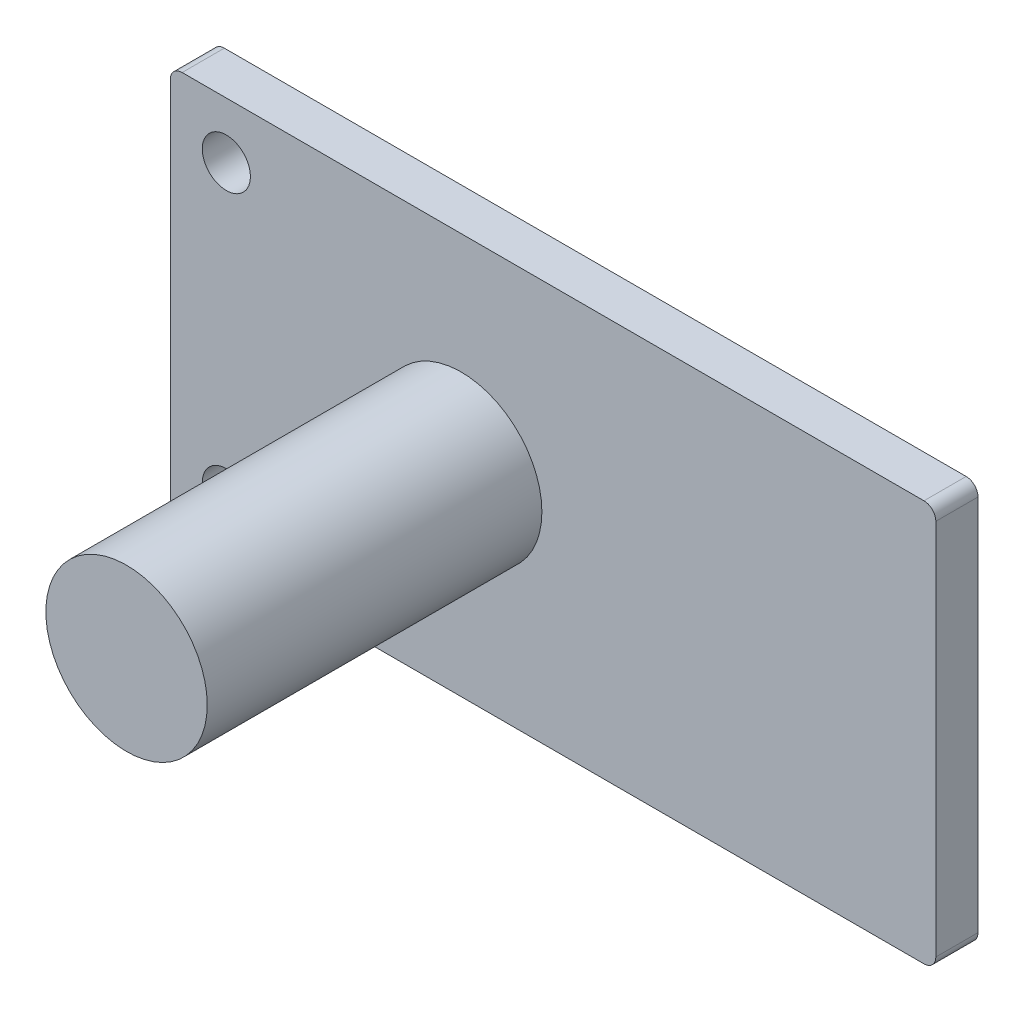
ISO-10303-21;
HEADER;
FILE_DESCRIPTION(('STEP AP214'),'2;1');
FILE_NAME('part.step','',(''),(''),'','','');
FILE_SCHEMA(('AUTOMOTIVE_DESIGN { 1 0 10303 214 1 1 1 1 }'));
ENDSEC;
DATA;
#1=APPLICATION_CONTEXT('core data for automotive mechanical design processes');
#2=APPLICATION_PROTOCOL_DEFINITION('international standard','automotive_design',2000,#1);
#3=PRODUCT_CONTEXT('',#1,'mechanical');
#4=PRODUCT('Part','Part','',(#3));
#5=PRODUCT_RELATED_PRODUCT_CATEGORY('part','',(#4));
#6=PRODUCT_DEFINITION_FORMATION('','',#4);
#7=PRODUCT_DEFINITION_CONTEXT('part definition',#1,'design');
#8=PRODUCT_DEFINITION('design','',#6,#7);
#9=PRODUCT_DEFINITION_SHAPE('','',#8);
#10=(LENGTH_UNIT() NAMED_UNIT(*) SI_UNIT(.MILLI.,.METRE.));
#11=(NAMED_UNIT(*) PLANE_ANGLE_UNIT() SI_UNIT($,.RADIAN.));
#12=(NAMED_UNIT(*) SI_UNIT($,.STERADIAN.) SOLID_ANGLE_UNIT());
#13=UNCERTAINTY_MEASURE_WITH_UNIT(LENGTH_MEASURE(1.E-05),#10,'distance_accuracy_value','');
#14=(GEOMETRIC_REPRESENTATION_CONTEXT(3) GLOBAL_UNCERTAINTY_ASSIGNED_CONTEXT((#13)) GLOBAL_UNIT_ASSIGNED_CONTEXT((#10,
#11,#12)) REPRESENTATION_CONTEXT('',''));
#15=CARTESIAN_POINT('',(0.,0.,0.));
#16=DIRECTION('',(0.,0.,1.));
#17=DIRECTION('',(1.,0.,0.));
#18=AXIS2_PLACEMENT_3D('',#15,#16,#17);
#19=CARTESIAN_POINT('',(0.500000000000001,0.5,1.78));
#20=DIRECTION('',(0.,0.,-1.));
#21=DIRECTION('',(-1.,0.,0.));
#22=AXIS2_PLACEMENT_3D('',#19,#20,#21);
#23=CYLINDRICAL_SURFACE('',#22,0.5);
#24=CARTESIAN_POINT('',(0.500000000000001,0.5,0.));
#25=DIRECTION('',(0.,0.,1.));
#26=DIRECTION('',(1.,0.,0.));
#27=AXIS2_PLACEMENT_3D('',#24,#25,#26);
#28=CIRCLE('',#27,0.5);
#29=CARTESIAN_POINT('',(0.,0.5,0.));
#30=VERTEX_POINT('',#29);
#31=CARTESIAN_POINT('',(0.5,0.,0.));
#32=VERTEX_POINT('',#31);
#33=EDGE_CURVE('E137',#30,#32,#28,.T.);
#34=ORIENTED_EDGE('',*,*,#33,.T.);
#35=DIRECTION('',(0.,0.,-1.));
#36=VECTOR('',#35,1.);
#37=CARTESIAN_POINT('',(0.5,0.,1.78));
#38=LINE('',#37,#36);
#39=CARTESIAN_POINT('',(0.5,0.,1.78));
#40=VERTEX_POINT('',#39);
#41=EDGE_CURVE('E42',#40,#32,#38,.T.);
#42=ORIENTED_EDGE('',*,*,#41,.F.);
#43=CARTESIAN_POINT('',(0.500000000000001,0.5,1.78));
#44=DIRECTION('',(0.,0.,1.));
#45=DIRECTION('',(1.,0.,0.));
#46=AXIS2_PLACEMENT_3D('',#43,#44,#45);
#47=CIRCLE('',#46,0.5);
#48=CARTESIAN_POINT('',(0.,0.5,1.78));
#49=VERTEX_POINT('',#48);
#50=EDGE_CURVE('E152',#49,#40,#47,.T.);
#51=ORIENTED_EDGE('',*,*,#50,.F.);
#52=DIRECTION('',(0.,0.,-1.));
#53=VECTOR('',#52,1.);
#54=CARTESIAN_POINT('',(0.,0.5,1.78));
#55=LINE('',#54,#53);
#56=EDGE_CURVE('E134',#49,#30,#55,.T.);
#57=ORIENTED_EDGE('',*,*,#56,.T.);
#58=EDGE_LOOP('',(#34,#42,#51,#57));
#59=FACE_BOUND('',#58,.T.);
#60=ADVANCED_FACE('F41',(#59),#23,.T.);
#61=CARTESIAN_POINT('',(0.5,0.,1.78));
#62=DIRECTION('',(0.,1.,0.));
#63=DIRECTION('',(0.,0.,1.));
#64=AXIS2_PLACEMENT_3D('',#61,#62,#63);
#65=PLANE('',#64);
#66=DIRECTION('',(1.,0.,0.));
#67=VECTOR('',#66,1.);
#68=CARTESIAN_POINT('',(0.5,0.,0.));
#69=LINE('',#68,#67);
#70=CARTESIAN_POINT('',(31.8,0.,0.));
#71=VERTEX_POINT('',#70);
#72=EDGE_CURVE('E142',#32,#71,#69,.T.);
#73=ORIENTED_EDGE('',*,*,#72,.T.);
#74=DIRECTION('',(0.,0.,-1.));
#75=VECTOR('',#74,1.);
#76=CARTESIAN_POINT('',(31.8,0.,1.78));
#77=LINE('',#76,#75);
#78=CARTESIAN_POINT('',(31.8,0.,1.78));
#79=VERTEX_POINT('',#78);
#80=EDGE_CURVE('E162',#79,#71,#77,.T.);
#81=ORIENTED_EDGE('',*,*,#80,.F.);
#82=DIRECTION('',(1.,0.,0.));
#83=VECTOR('',#82,1.);
#84=CARTESIAN_POINT('',(0.5,0.,1.78));
#85=LINE('',#84,#83);
#86=EDGE_CURVE('E105',#40,#79,#85,.T.);
#87=ORIENTED_EDGE('',*,*,#86,.F.);
#88=ORIENTED_EDGE('',*,*,#41,.T.);
#89=EDGE_LOOP('',(#73,#81,#87,#88));
#90=FACE_BOUND('',#89,.T.);
#91=ADVANCED_FACE('F166',(#90),#65,.F.);
#92=CARTESIAN_POINT('',(31.8,0.499999999999991,1.78));
#93=DIRECTION('',(0.,0.,-1.));
#94=DIRECTION('',(-1.,0.,0.));
#95=AXIS2_PLACEMENT_3D('',#92,#93,#94);
#96=CYLINDRICAL_SURFACE('',#95,0.499999999999989);
#97=CARTESIAN_POINT('',(31.8,0.499999999999991,0.));
#98=DIRECTION('',(0.,0.,1.));
#99=DIRECTION('',(1.,0.,0.));
#100=AXIS2_PLACEMENT_3D('',#97,#98,#99);
#101=CIRCLE('',#100,0.499999999999989);
#102=CARTESIAN_POINT('',(32.3,0.499999999999991,0.));
#103=VERTEX_POINT('',#102);
#104=EDGE_CURVE('E144',#71,#103,#101,.T.);
#105=ORIENTED_EDGE('',*,*,#104,.T.);
#106=DIRECTION('',(0.,0.,-1.));
#107=VECTOR('',#106,1.);
#108=CARTESIAN_POINT('',(32.3,0.499999999999991,1.78));
#109=LINE('',#108,#107);
#110=CARTESIAN_POINT('',(32.3,0.499999999999991,1.78));
#111=VERTEX_POINT('',#110);
#112=EDGE_CURVE('E161',#111,#103,#109,.T.);
#113=ORIENTED_EDGE('',*,*,#112,.F.);
#114=CARTESIAN_POINT('',(31.8,0.499999999999991,1.78));
#115=DIRECTION('',(0.,0.,1.));
#116=DIRECTION('',(1.,0.,0.));
#117=AXIS2_PLACEMENT_3D('',#114,#115,#116);
#118=CIRCLE('',#117,0.499999999999989);
#119=EDGE_CURVE('E184',#79,#111,#118,.T.);
#120=ORIENTED_EDGE('',*,*,#119,.F.);
#121=ORIENTED_EDGE('',*,*,#80,.T.);
#122=EDGE_LOOP('',(#105,#113,#120,#121));
#123=FACE_BOUND('',#122,.T.);
#124=ADVANCED_FACE('F178',(#123),#96,.T.);
#125=CARTESIAN_POINT('',(32.3,0.5,1.78));
#126=DIRECTION('',(-1.,0.,0.));
#127=DIRECTION('',(0.,0.,1.));
#128=AXIS2_PLACEMENT_3D('',#125,#126,#127);
#129=PLANE('',#128);
#130=DIRECTION('',(0.,1.,0.));
#131=VECTOR('',#130,1.);
#132=CARTESIAN_POINT('',(32.3,0.5,0.));
#133=LINE('',#132,#131);
#134=CARTESIAN_POINT('',(32.3,16.42,0.));
#135=VERTEX_POINT('',#134);
#136=EDGE_CURVE('E150',#103,#135,#133,.T.);
#137=ORIENTED_EDGE('',*,*,#136,.T.);
#138=DIRECTION('',(0.,0.,-1.));
#139=VECTOR('',#138,1.);
#140=CARTESIAN_POINT('',(32.3,16.42,1.78));
#141=LINE('',#140,#139);
#142=CARTESIAN_POINT('',(32.3,16.42,1.78));
#143=VERTEX_POINT('',#142);
#144=EDGE_CURVE('E158',#143,#135,#141,.T.);
#145=ORIENTED_EDGE('',*,*,#144,.F.);
#146=DIRECTION('',(0.,1.,0.));
#147=VECTOR('',#146,1.);
#148=CARTESIAN_POINT('',(32.3,0.5,1.78));
#149=LINE('',#148,#147);
#150=EDGE_CURVE('E181',#111,#143,#149,.T.);
#151=ORIENTED_EDGE('',*,*,#150,.F.);
#152=ORIENTED_EDGE('',*,*,#112,.T.);
#153=EDGE_LOOP('',(#137,#145,#151,#152));
#154=FACE_BOUND('',#153,.T.);
#155=ADVANCED_FACE('F182',(#154),#129,.F.);
#156=CARTESIAN_POINT('',(31.8,16.42,1.78));
#157=DIRECTION('',(0.,0.,-1.));
#158=DIRECTION('',(-1.,0.,0.));
#159=AXIS2_PLACEMENT_3D('',#156,#157,#158);
#160=CYLINDRICAL_SURFACE('',#159,0.499999999999994);
#161=CARTESIAN_POINT('',(31.8,16.42,0.));
#162=DIRECTION('',(0.,0.,1.));
#163=DIRECTION('',(1.,0.,0.));
#164=AXIS2_PLACEMENT_3D('',#161,#162,#163);
#165=CIRCLE('',#164,0.499999999999994);
#166=CARTESIAN_POINT('',(31.8,16.92,0.));
#167=VERTEX_POINT('',#166);
#168=EDGE_CURVE('E149',#135,#167,#165,.T.);
#169=ORIENTED_EDGE('',*,*,#168,.T.);
#170=DIRECTION('',(0.,0.,-1.));
#171=VECTOR('',#170,1.);
#172=CARTESIAN_POINT('',(31.8,16.92,1.78));
#173=LINE('',#172,#171);
#174=CARTESIAN_POINT('',(31.8,16.92,1.78));
#175=VERTEX_POINT('',#174);
#176=EDGE_CURVE('E128',#175,#167,#173,.T.);
#177=ORIENTED_EDGE('',*,*,#176,.F.);
#178=CARTESIAN_POINT('',(31.8,16.42,1.78));
#179=DIRECTION('',(0.,0.,1.));
#180=DIRECTION('',(1.,0.,0.));
#181=AXIS2_PLACEMENT_3D('',#178,#179,#180);
#182=CIRCLE('',#181,0.499999999999994);
#183=EDGE_CURVE('E121',#143,#175,#182,.T.);
#184=ORIENTED_EDGE('',*,*,#183,.F.);
#185=ORIENTED_EDGE('',*,*,#144,.T.);
#186=EDGE_LOOP('',(#169,#177,#184,#185));
#187=FACE_BOUND('',#186,.T.);
#188=ADVANCED_FACE('F246',(#187),#160,.T.);
#189=CARTESIAN_POINT('',(31.8,16.92,1.78));
#190=DIRECTION('',(0.,-1.,0.));
#191=DIRECTION('',(0.,0.,-1.));
#192=AXIS2_PLACEMENT_3D('',#189,#190,#191);
#193=PLANE('',#192);
#194=DIRECTION('',(-1.,0.,0.));
#195=VECTOR('',#194,1.);
#196=CARTESIAN_POINT('',(31.8,16.92,0.));
#197=LINE('',#196,#195);
#198=CARTESIAN_POINT('',(0.5,16.92,0.));
#199=VERTEX_POINT('',#198);
#200=EDGE_CURVE('E129',#167,#199,#197,.T.);
#201=ORIENTED_EDGE('',*,*,#200,.T.);
#202=DIRECTION('',(0.,0.,-1.));
#203=VECTOR('',#202,1.);
#204=CARTESIAN_POINT('',(0.5,16.92,1.78));
#205=LINE('',#204,#203);
#206=CARTESIAN_POINT('',(0.5,16.92,1.78));
#207=VERTEX_POINT('',#206);
#208=EDGE_CURVE('E127',#207,#199,#205,.T.);
#209=ORIENTED_EDGE('',*,*,#208,.F.);
#210=DIRECTION('',(-1.,0.,0.));
#211=VECTOR('',#210,1.);
#212=CARTESIAN_POINT('',(31.8,16.92,1.78));
#213=LINE('',#212,#211);
#214=EDGE_CURVE('E113',#175,#207,#213,.T.);
#215=ORIENTED_EDGE('',*,*,#214,.F.);
#216=ORIENTED_EDGE('',*,*,#176,.T.);
#217=EDGE_LOOP('',(#201,#209,#215,#216));
#218=FACE_BOUND('',#217,.T.);
#219=ADVANCED_FACE('F130',(#218),#193,.F.);
#220=CARTESIAN_POINT('',(0.500000000000003,16.42,1.78));
#221=DIRECTION('',(0.,0.,-1.));
#222=DIRECTION('',(-1.,0.,0.));
#223=AXIS2_PLACEMENT_3D('',#220,#221,#222);
#224=CYLINDRICAL_SURFACE('',#223,0.500000000000003);
#225=CARTESIAN_POINT('',(0.500000000000003,16.42,0.));
#226=DIRECTION('',(0.,0.,1.));
#227=DIRECTION('',(1.,0.,0.));
#228=AXIS2_PLACEMENT_3D('',#225,#226,#227);
#229=CIRCLE('',#228,0.500000000000003);
#230=CARTESIAN_POINT('',(0.,16.42,0.));
#231=VERTEX_POINT('',#230);
#232=EDGE_CURVE('E87',#199,#231,#229,.T.);
#233=ORIENTED_EDGE('',*,*,#232,.T.);
#234=DIRECTION('',(0.,0.,-1.));
#235=VECTOR('',#234,1.);
#236=CARTESIAN_POINT('',(0.,16.42,1.78));
#237=LINE('',#236,#235);
#238=CARTESIAN_POINT('',(0.,16.42,1.78));
#239=VERTEX_POINT('',#238);
#240=EDGE_CURVE('E133',#239,#231,#237,.T.);
#241=ORIENTED_EDGE('',*,*,#240,.F.);
#242=CARTESIAN_POINT('',(0.500000000000003,16.42,1.78));
#243=DIRECTION('',(0.,0.,1.));
#244=DIRECTION('',(1.,0.,0.));
#245=AXIS2_PLACEMENT_3D('',#242,#243,#244);
#246=CIRCLE('',#245,0.500000000000003);
#247=EDGE_CURVE('E117',#207,#239,#246,.T.);
#248=ORIENTED_EDGE('',*,*,#247,.F.);
#249=ORIENTED_EDGE('',*,*,#208,.T.);
#250=EDGE_LOOP('',(#233,#241,#248,#249));
#251=FACE_BOUND('',#250,.T.);
#252=ADVANCED_FACE('F131',(#251),#224,.T.);
#253=CARTESIAN_POINT('',(0.,16.42,1.78));
#254=DIRECTION('',(1.,0.,0.));
#255=DIRECTION('',(0.,0.,-1.));
#256=AXIS2_PLACEMENT_3D('',#253,#254,#255);
#257=PLANE('',#256);
#258=DIRECTION('',(0.,-1.,0.));
#259=VECTOR('',#258,1.);
#260=CARTESIAN_POINT('',(0.,16.42,0.));
#261=LINE('',#260,#259);
#262=EDGE_CURVE('E91',#231,#30,#261,.T.);
#263=ORIENTED_EDGE('',*,*,#262,.T.);
#264=ORIENTED_EDGE('',*,*,#56,.F.);
#265=DIRECTION('',(0.,-1.,0.));
#266=VECTOR('',#265,1.);
#267=CARTESIAN_POINT('',(0.,16.42,1.78));
#268=LINE('',#267,#266);
#269=EDGE_CURVE('E59',#239,#49,#268,.T.);
#270=ORIENTED_EDGE('',*,*,#269,.F.);
#271=ORIENTED_EDGE('',*,*,#240,.T.);
#272=EDGE_LOOP('',(#263,#264,#270,#271));
#273=FACE_BOUND('',#272,.T.);
#274=ADVANCED_FACE('F216',(#273),#257,.F.);
#275=CARTESIAN_POINT('',(0.500000000000001,0.5,1.78));
#276=DIRECTION('',(0.,0.,1.));
#277=DIRECTION('',(1.,0.,0.));
#278=AXIS2_PLACEMENT_3D('',#275,#276,#277);
#279=PLANE('',#278);
#280=CARTESIAN_POINT('',(12.275,8.46,1.78));
#281=DIRECTION('',(0.,0.,1.));
#282=DIRECTION('',(1.,0.,0.));
#283=AXIS2_PLACEMENT_3D('',#280,#281,#282);
#284=CIRCLE('',#283,3.405);
#285=CARTESIAN_POINT('',(15.68,8.46,1.78));
#286=VERTEX_POINT('',#285);
#287=EDGE_CURVE('E11',#286,#286,#284,.T.);
#288=ORIENTED_EDGE('',*,*,#287,.F.);
#289=EDGE_LOOP('',(#288));
#290=FACE_BOUND('',#289,.T.);
#291=CARTESIAN_POINT('',(2.365,2.365,1.78));
#292=DIRECTION('',(0.,0.,1.));
#293=DIRECTION('',(1.,0.,0.));
#294=AXIS2_PLACEMENT_3D('',#291,#292,#293);
#295=CIRCLE('',#294,1.015);
#296=CARTESIAN_POINT('',(3.38,2.365,1.78));
#297=VERTEX_POINT('',#296);
#298=EDGE_CURVE('E141',#297,#297,#295,.F.);
#299=ORIENTED_EDGE('',*,*,#298,.T.);
#300=EDGE_LOOP('',(#299));
#301=FACE_BOUND('',#300,.T.);
#302=CARTESIAN_POINT('',(2.365,14.555,1.78));
#303=DIRECTION('',(0.,0.,1.));
#304=DIRECTION('',(1.,0.,0.));
#305=AXIS2_PLACEMENT_3D('',#302,#303,#304);
#306=CIRCLE('',#305,1.015);
#307=CARTESIAN_POINT('',(3.38,14.555,1.78));
#308=VERTEX_POINT('',#307);
#309=EDGE_CURVE('E195',#308,#308,#306,.F.);
#310=ORIENTED_EDGE('',*,*,#309,.T.);
#311=EDGE_LOOP('',(#310));
#312=FACE_BOUND('',#311,.T.);
#313=ORIENTED_EDGE('',*,*,#50,.T.);
#314=ORIENTED_EDGE('',*,*,#86,.T.);
#315=ORIENTED_EDGE('',*,*,#119,.T.);
#316=ORIENTED_EDGE('',*,*,#150,.T.);
#317=ORIENTED_EDGE('',*,*,#183,.T.);
#318=ORIENTED_EDGE('',*,*,#214,.T.);
#319=ORIENTED_EDGE('',*,*,#247,.T.);
#320=ORIENTED_EDGE('',*,*,#269,.T.);
#321=EDGE_LOOP('',(#313,#314,#315,#316,#317,#318,#319,#320));
#322=FACE_BOUND('',#321,.T.);
#323=ADVANCED_FACE('F120',(#290,#301,#312,#322),#279,.T.);
#324=CARTESIAN_POINT('',(0.500000000000001,0.5,0.));
#325=DIRECTION('',(0.,0.,1.));
#326=DIRECTION('',(1.,0.,0.));
#327=AXIS2_PLACEMENT_3D('',#324,#325,#326);
#328=PLANE('',#327);
#329=CARTESIAN_POINT('',(2.365,2.365,0.));
#330=DIRECTION('',(0.,0.,1.));
#331=DIRECTION('',(1.,0.,0.));
#332=AXIS2_PLACEMENT_3D('',#329,#330,#331);
#333=CIRCLE('',#332,1.015);
#334=CARTESIAN_POINT('',(3.38,2.365,0.));
#335=VERTEX_POINT('',#334);
#336=EDGE_CURVE('E194',#335,#335,#333,.T.);
#337=ORIENTED_EDGE('',*,*,#336,.T.);
#338=EDGE_LOOP('',(#337));
#339=FACE_BOUND('',#338,.T.);
#340=CARTESIAN_POINT('',(2.365,14.555,0.));
#341=DIRECTION('',(0.,0.,1.));
#342=DIRECTION('',(1.,0.,0.));
#343=AXIS2_PLACEMENT_3D('',#340,#341,#342);
#344=CIRCLE('',#343,1.015);
#345=CARTESIAN_POINT('',(3.38,14.555,0.));
#346=VERTEX_POINT('',#345);
#347=EDGE_CURVE('E198',#346,#346,#344,.T.);
#348=ORIENTED_EDGE('',*,*,#347,.T.);
#349=EDGE_LOOP('',(#348));
#350=FACE_BOUND('',#349,.T.);
#351=ORIENTED_EDGE('',*,*,#33,.F.);
#352=ORIENTED_EDGE('',*,*,#262,.F.);
#353=ORIENTED_EDGE('',*,*,#232,.F.);
#354=ORIENTED_EDGE('',*,*,#200,.F.);
#355=ORIENTED_EDGE('',*,*,#168,.F.);
#356=ORIENTED_EDGE('',*,*,#136,.F.);
#357=ORIENTED_EDGE('',*,*,#104,.F.);
#358=ORIENTED_EDGE('',*,*,#72,.F.);
#359=EDGE_LOOP('',(#351,#352,#353,#354,#355,#356,#357,#358));
#360=FACE_BOUND('',#359,.T.);
#361=ADVANCED_FACE('F172',(#339,#350,#360),#328,.F.);
#362=CARTESIAN_POINT('',(2.365,14.555,2.));
#363=DIRECTION('',(0.,0.,-1.));
#364=DIRECTION('',(-1.,0.,0.));
#365=AXIS2_PLACEMENT_3D('',#362,#363,#364);
#366=CYLINDRICAL_SURFACE('',#365,1.015);
#367=ORIENTED_EDGE('',*,*,#309,.F.);
#368=EDGE_LOOP('',(#367));
#369=FACE_BOUND('',#368,.T.);
#370=ORIENTED_EDGE('',*,*,#347,.F.);
#371=EDGE_LOOP('',(#370));
#372=FACE_BOUND('',#371,.T.);
#373=ADVANCED_FACE('F225',(#369,#372),#366,.F.);
#374=CARTESIAN_POINT('',(2.365,2.365,2.));
#375=DIRECTION('',(0.,0.,-1.));
#376=DIRECTION('',(-1.,0.,0.));
#377=AXIS2_PLACEMENT_3D('',#374,#375,#376);
#378=CYLINDRICAL_SURFACE('',#377,1.015);
#379=ORIENTED_EDGE('',*,*,#298,.F.);
#380=EDGE_LOOP('',(#379));
#381=FACE_BOUND('',#380,.T.);
#382=ORIENTED_EDGE('',*,*,#336,.F.);
#383=EDGE_LOOP('',(#382));
#384=FACE_BOUND('',#383,.T.);
#385=ADVANCED_FACE('F209',(#381,#384),#378,.F.);
#386=CARTESIAN_POINT('',(12.275,8.46,15.9));
#387=DIRECTION('',(0.,0.,-1.));
#388=DIRECTION('',(-1.,0.,0.));
#389=AXIS2_PLACEMENT_3D('',#386,#387,#388);
#390=CYLINDRICAL_SURFACE('',#389,3.405);
#391=CARTESIAN_POINT('',(12.275,8.46,15.9));
#392=DIRECTION('',(0.,0.,1.));
#393=DIRECTION('',(1.,0.,0.));
#394=AXIS2_PLACEMENT_3D('',#391,#392,#393);
#395=CIRCLE('',#394,3.405);
#396=CARTESIAN_POINT('',(15.68,8.46,15.9));
#397=VERTEX_POINT('',#396);
#398=EDGE_CURVE('E200',#397,#397,#395,.T.);
#399=ORIENTED_EDGE('',*,*,#398,.F.);
#400=EDGE_LOOP('',(#399));
#401=FACE_BOUND('',#400,.T.);
#402=ORIENTED_EDGE('',*,*,#287,.T.);
#403=EDGE_LOOP('',(#402));
#404=FACE_BOUND('',#403,.T.);
#405=ADVANCED_FACE('F210',(#401,#404),#390,.T.);
#406=CARTESIAN_POINT('',(12.275,8.46,15.9));
#407=DIRECTION('',(0.,0.,1.));
#408=DIRECTION('',(1.,0.,0.));
#409=AXIS2_PLACEMENT_3D('',#406,#407,#408);
#410=PLANE('',#409);
#411=ORIENTED_EDGE('',*,*,#398,.T.);
#412=EDGE_LOOP('',(#411));
#413=FACE_BOUND('',#412,.T.);
#414=ADVANCED_FACE('F202',(#413),#410,.T.);
#415=CLOSED_SHELL('',(#60,#91,#124,#155,#188,#219,#252,#274,#323,#361,#373,#385,#405,#414));
#416=MANIFOLD_SOLID_BREP('B2',#415);
#417=ADVANCED_BREP_SHAPE_REPRESENTATION('',(#18,#416),#14);
#418=SHAPE_DEFINITION_REPRESENTATION(#9,#417);
ENDSEC;
END-ISO-10303-21;
